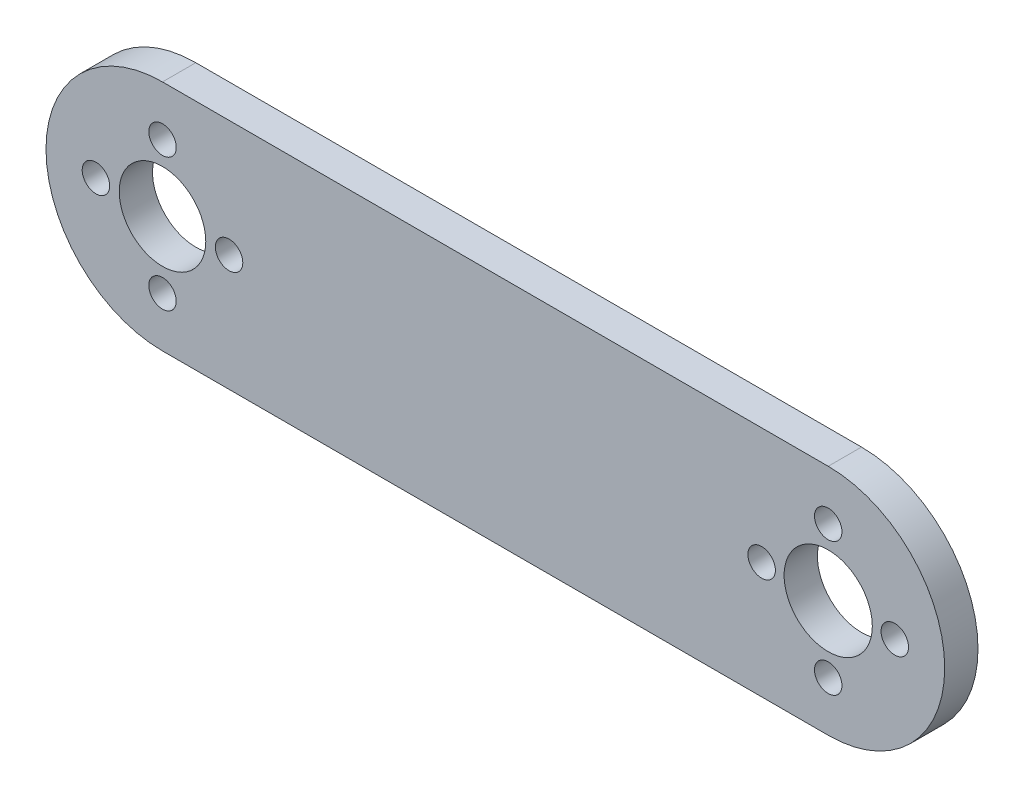
ISO-10303-21;
HEADER;
FILE_DESCRIPTION(('STEP AP214'),'2;1');
FILE_NAME('part.step','',(''),(''),'','','');
FILE_SCHEMA(('AUTOMOTIVE_DESIGN { 1 0 10303 214 1 1 1 1 }'));
ENDSEC;
DATA;
#1=APPLICATION_CONTEXT('core data for automotive mechanical design processes');
#2=APPLICATION_PROTOCOL_DEFINITION('international standard','automotive_design',2000,#1);
#3=PRODUCT_CONTEXT('',#1,'mechanical');
#4=PRODUCT('Part','Part','',(#3));
#5=PRODUCT_RELATED_PRODUCT_CATEGORY('part','',(#4));
#6=PRODUCT_DEFINITION_FORMATION('','',#4);
#7=PRODUCT_DEFINITION_CONTEXT('part definition',#1,'design');
#8=PRODUCT_DEFINITION('design','',#6,#7);
#9=PRODUCT_DEFINITION_SHAPE('','',#8);
#10=(LENGTH_UNIT() NAMED_UNIT(*) SI_UNIT(.MILLI.,.METRE.));
#11=(NAMED_UNIT(*) PLANE_ANGLE_UNIT() SI_UNIT($,.RADIAN.));
#12=(NAMED_UNIT(*) SI_UNIT($,.STERADIAN.) SOLID_ANGLE_UNIT());
#13=UNCERTAINTY_MEASURE_WITH_UNIT(LENGTH_MEASURE(1.E-05),#10,'distance_accuracy_value','');
#14=(GEOMETRIC_REPRESENTATION_CONTEXT(3) GLOBAL_UNCERTAINTY_ASSIGNED_CONTEXT((#13)) GLOBAL_UNIT_ASSIGNED_CONTEXT((#10,
#11,#12)) REPRESENTATION_CONTEXT('',''));
#15=CARTESIAN_POINT('',(0.,0.,0.));
#16=DIRECTION('',(0.,0.,1.));
#17=DIRECTION('',(1.,0.,0.));
#18=AXIS2_PLACEMENT_3D('',#15,#16,#17);
#19=CARTESIAN_POINT('',(0.,0.,4.));
#20=DIRECTION('',(0.,0.,-1.));
#21=DIRECTION('',(-1.,0.,0.));
#22=AXIS2_PLACEMENT_3D('',#19,#20,#21);
#23=CYLINDRICAL_SURFACE('',#22,14.);
#24=CARTESIAN_POINT('',(0.,0.,0.));
#25=DIRECTION('',(0.,0.,1.));
#26=DIRECTION('',(1.,0.,0.));
#27=AXIS2_PLACEMENT_3D('',#24,#25,#26);
#28=CIRCLE('',#27,14.);
#29=CARTESIAN_POINT('',(0.,14.,0.));
#30=VERTEX_POINT('',#29);
#31=CARTESIAN_POINT('',(0.,-14.,0.));
#32=VERTEX_POINT('',#31);
#33=EDGE_CURVE('E132',#30,#32,#28,.T.);
#34=ORIENTED_EDGE('',*,*,#33,.T.);
#35=DIRECTION('',(0.,0.,-1.));
#36=VECTOR('',#35,1.);
#37=CARTESIAN_POINT('',(0.,-14.,4.));
#38=LINE('',#37,#36);
#39=CARTESIAN_POINT('',(0.,-14.,4.));
#40=VERTEX_POINT('',#39);
#41=EDGE_CURVE('E11',#40,#32,#38,.T.);
#42=ORIENTED_EDGE('',*,*,#41,.F.);
#43=CARTESIAN_POINT('',(0.,0.,4.));
#44=DIRECTION('',(0.,0.,1.));
#45=DIRECTION('',(1.,0.,0.));
#46=AXIS2_PLACEMENT_3D('',#43,#44,#45);
#47=CIRCLE('',#46,14.);
#48=CARTESIAN_POINT('',(0.,14.,4.));
#49=VERTEX_POINT('',#48);
#50=EDGE_CURVE('E88',#49,#40,#47,.T.);
#51=ORIENTED_EDGE('',*,*,#50,.F.);
#52=DIRECTION('',(0.,0.,-1.));
#53=VECTOR('',#52,1.);
#54=CARTESIAN_POINT('',(0.,14.,4.));
#55=LINE('',#54,#53);
#56=EDGE_CURVE('E54',#49,#30,#55,.T.);
#57=ORIENTED_EDGE('',*,*,#56,.T.);
#58=EDGE_LOOP('',(#34,#42,#51,#57));
#59=FACE_BOUND('',#58,.T.);
#60=ADVANCED_FACE('F37',(#59),#23,.T.);
#61=CARTESIAN_POINT('',(0.,-14.,4.));
#62=DIRECTION('',(0.,1.,0.));
#63=DIRECTION('',(-1.,0.,0.));
#64=AXIS2_PLACEMENT_3D('',#61,#62,#63);
#65=PLANE('',#64);
#66=DIRECTION('',(1.,0.,0.));
#67=VECTOR('',#66,1.);
#68=CARTESIAN_POINT('',(0.,-14.,0.));
#69=LINE('',#68,#67);
#70=CARTESIAN_POINT('',(80.,-14.,0.));
#71=VERTEX_POINT('',#70);
#72=EDGE_CURVE('E93',#32,#71,#69,.T.);
#73=ORIENTED_EDGE('',*,*,#72,.T.);
#74=DIRECTION('',(0.,0.,-1.));
#75=VECTOR('',#74,1.);
#76=CARTESIAN_POINT('',(80.,-14.,4.));
#77=LINE('',#76,#75);
#78=CARTESIAN_POINT('',(80.,-14.,4.));
#79=VERTEX_POINT('',#78);
#80=EDGE_CURVE('E46',#79,#71,#77,.T.);
#81=ORIENTED_EDGE('',*,*,#80,.F.);
#82=DIRECTION('',(1.,0.,0.));
#83=VECTOR('',#82,1.);
#84=CARTESIAN_POINT('',(0.,-14.,4.));
#85=LINE('',#84,#83);
#86=EDGE_CURVE('E80',#40,#79,#85,.T.);
#87=ORIENTED_EDGE('',*,*,#86,.F.);
#88=ORIENTED_EDGE('',*,*,#41,.T.);
#89=EDGE_LOOP('',(#73,#81,#87,#88));
#90=FACE_BOUND('',#89,.T.);
#91=ADVANCED_FACE('F92',(#90),#65,.F.);
#92=CARTESIAN_POINT('',(80.,0.,4.));
#93=DIRECTION('',(0.,0.,-1.));
#94=DIRECTION('',(-1.,0.,0.));
#95=AXIS2_PLACEMENT_3D('',#92,#93,#94);
#96=CYLINDRICAL_SURFACE('',#95,14.);
#97=CARTESIAN_POINT('',(80.,0.,0.));
#98=DIRECTION('',(0.,0.,1.));
#99=DIRECTION('',(1.,0.,0.));
#100=AXIS2_PLACEMENT_3D('',#97,#98,#99);
#101=CIRCLE('',#100,14.);
#102=CARTESIAN_POINT('',(80.,14.,0.));
#103=VERTEX_POINT('',#102);
#104=EDGE_CURVE('E135',#71,#103,#101,.T.);
#105=ORIENTED_EDGE('',*,*,#104,.T.);
#106=DIRECTION('',(0.,0.,-1.));
#107=VECTOR('',#106,1.);
#108=CARTESIAN_POINT('',(80.,14.,4.));
#109=LINE('',#108,#107);
#110=CARTESIAN_POINT('',(80.,14.,4.));
#111=VERTEX_POINT('',#110);
#112=EDGE_CURVE('E69',#111,#103,#109,.T.);
#113=ORIENTED_EDGE('',*,*,#112,.F.);
#114=CARTESIAN_POINT('',(80.,0.,4.));
#115=DIRECTION('',(0.,0.,1.));
#116=DIRECTION('',(1.,0.,0.));
#117=AXIS2_PLACEMENT_3D('',#114,#115,#116);
#118=CIRCLE('',#117,14.);
#119=EDGE_CURVE('E87',#79,#111,#118,.T.);
#120=ORIENTED_EDGE('',*,*,#119,.F.);
#121=ORIENTED_EDGE('',*,*,#80,.T.);
#122=EDGE_LOOP('',(#105,#113,#120,#121));
#123=FACE_BOUND('',#122,.T.);
#124=ADVANCED_FACE('F96',(#123),#96,.T.);
#125=CARTESIAN_POINT('',(0.,14.,4.));
#126=DIRECTION('',(0.,1.,0.));
#127=DIRECTION('',(-1.,0.,0.));
#128=AXIS2_PLACEMENT_3D('',#125,#126,#127);
#129=PLANE('',#128);
#130=DIRECTION('',(1.,0.,0.));
#131=VECTOR('',#130,1.);
#132=CARTESIAN_POINT('',(0.,14.,0.));
#133=LINE('',#132,#131);
#134=EDGE_CURVE('E137',#30,#103,#133,.T.);
#135=ORIENTED_EDGE('',*,*,#134,.F.);
#136=ORIENTED_EDGE('',*,*,#56,.F.);
#137=DIRECTION('',(1.,0.,0.));
#138=VECTOR('',#137,1.);
#139=CARTESIAN_POINT('',(0.,14.,4.));
#140=LINE('',#139,#138);
#141=EDGE_CURVE('E97',#49,#111,#140,.T.);
#142=ORIENTED_EDGE('',*,*,#141,.T.);
#143=ORIENTED_EDGE('',*,*,#112,.T.);
#144=EDGE_LOOP('',(#135,#136,#142,#143));
#145=FACE_BOUND('',#144,.T.);
#146=ADVANCED_FACE('F205',(#145),#129,.T.);
#147=CARTESIAN_POINT('',(0.,0.,4.));
#148=DIRECTION('',(0.,0.,-1.));
#149=DIRECTION('',(-1.,0.,0.));
#150=AXIS2_PLACEMENT_3D('',#147,#148,#149);
#151=CYLINDRICAL_SURFACE('',#150,5.2);
#152=CARTESIAN_POINT('',(0.,0.,4.));
#153=DIRECTION('',(0.,0.,1.));
#154=DIRECTION('',(1.,0.,0.));
#155=AXIS2_PLACEMENT_3D('',#152,#153,#154);
#156=CIRCLE('',#155,5.2);
#157=CARTESIAN_POINT('',(5.2,0.,4.));
#158=VERTEX_POINT('',#157);
#159=EDGE_CURVE('E173',#158,#158,#156,.T.);
#160=ORIENTED_EDGE('',*,*,#159,.T.);
#161=EDGE_LOOP('',(#160));
#162=FACE_BOUND('',#161,.T.);
#163=CARTESIAN_POINT('',(0.,0.,0.));
#164=DIRECTION('',(0.,0.,1.));
#165=DIRECTION('',(1.,0.,0.));
#166=AXIS2_PLACEMENT_3D('',#163,#164,#165);
#167=CIRCLE('',#166,5.2);
#168=CARTESIAN_POINT('',(5.2,0.,0.));
#169=VERTEX_POINT('',#168);
#170=EDGE_CURVE('E129',#169,#169,#167,.T.);
#171=ORIENTED_EDGE('',*,*,#170,.F.);
#172=EDGE_LOOP('',(#171));
#173=FACE_BOUND('',#172,.T.);
#174=ADVANCED_FACE('F177',(#162,#173),#151,.F.);
#175=CARTESIAN_POINT('',(0.,-8.,4.));
#176=DIRECTION('',(0.,0.,-1.));
#177=DIRECTION('',(-1.,0.,0.));
#178=AXIS2_PLACEMENT_3D('',#175,#176,#177);
#179=CYLINDRICAL_SURFACE('',#178,1.65);
#180=CARTESIAN_POINT('',(0.,-8.,4.));
#181=DIRECTION('',(0.,0.,1.));
#182=DIRECTION('',(1.,0.,0.));
#183=AXIS2_PLACEMENT_3D('',#180,#181,#182);
#184=CIRCLE('',#183,1.65);
#185=CARTESIAN_POINT('',(1.65,-8.,4.));
#186=VERTEX_POINT('',#185);
#187=EDGE_CURVE('E170',#186,#186,#184,.T.);
#188=ORIENTED_EDGE('',*,*,#187,.T.);
#189=EDGE_LOOP('',(#188));
#190=FACE_BOUND('',#189,.T.);
#191=CARTESIAN_POINT('',(0.,-8.,0.));
#192=DIRECTION('',(0.,0.,1.));
#193=DIRECTION('',(1.,0.,0.));
#194=AXIS2_PLACEMENT_3D('',#191,#192,#193);
#195=CIRCLE('',#194,1.65);
#196=CARTESIAN_POINT('',(1.65,-8.,0.));
#197=VERTEX_POINT('',#196);
#198=EDGE_CURVE('E126',#197,#197,#195,.T.);
#199=ORIENTED_EDGE('',*,*,#198,.F.);
#200=EDGE_LOOP('',(#199));
#201=FACE_BOUND('',#200,.T.);
#202=ADVANCED_FACE('F204',(#190,#201),#179,.F.);
#203=CARTESIAN_POINT('',(8.,0.,4.));
#204=DIRECTION('',(0.,0.,-1.));
#205=DIRECTION('',(-1.,0.,0.));
#206=AXIS2_PLACEMENT_3D('',#203,#204,#205);
#207=CYLINDRICAL_SURFACE('',#206,1.65);
#208=CARTESIAN_POINT('',(8.,0.,4.));
#209=DIRECTION('',(0.,0.,1.));
#210=DIRECTION('',(1.,0.,0.));
#211=AXIS2_PLACEMENT_3D('',#208,#209,#210);
#212=CIRCLE('',#211,1.65);
#213=CARTESIAN_POINT('',(9.65,0.,4.));
#214=VERTEX_POINT('',#213);
#215=EDGE_CURVE('E167',#214,#214,#212,.T.);
#216=ORIENTED_EDGE('',*,*,#215,.T.);
#217=EDGE_LOOP('',(#216));
#218=FACE_BOUND('',#217,.T.);
#219=CARTESIAN_POINT('',(8.,0.,0.));
#220=DIRECTION('',(0.,0.,1.));
#221=DIRECTION('',(1.,0.,0.));
#222=AXIS2_PLACEMENT_3D('',#219,#220,#221);
#223=CIRCLE('',#222,1.65);
#224=CARTESIAN_POINT('',(9.65,0.,0.));
#225=VERTEX_POINT('',#224);
#226=EDGE_CURVE('E123',#225,#225,#223,.T.);
#227=ORIENTED_EDGE('',*,*,#226,.F.);
#228=EDGE_LOOP('',(#227));
#229=FACE_BOUND('',#228,.T.);
#230=ADVANCED_FACE('F208',(#218,#229),#207,.F.);
#231=CARTESIAN_POINT('',(0.,8.,4.));
#232=DIRECTION('',(0.,0.,-1.));
#233=DIRECTION('',(-1.,0.,0.));
#234=AXIS2_PLACEMENT_3D('',#231,#232,#233);
#235=CYLINDRICAL_SURFACE('',#234,1.65);
#236=CARTESIAN_POINT('',(0.,8.,4.));
#237=DIRECTION('',(0.,0.,1.));
#238=DIRECTION('',(1.,0.,0.));
#239=AXIS2_PLACEMENT_3D('',#236,#237,#238);
#240=CIRCLE('',#239,1.65);
#241=CARTESIAN_POINT('',(1.65,8.,4.));
#242=VERTEX_POINT('',#241);
#243=EDGE_CURVE('E164',#242,#242,#240,.T.);
#244=ORIENTED_EDGE('',*,*,#243,.T.);
#245=EDGE_LOOP('',(#244));
#246=FACE_BOUND('',#245,.T.);
#247=CARTESIAN_POINT('',(0.,8.,0.));
#248=DIRECTION('',(0.,0.,1.));
#249=DIRECTION('',(1.,0.,0.));
#250=AXIS2_PLACEMENT_3D('',#247,#248,#249);
#251=CIRCLE('',#250,1.65);
#252=CARTESIAN_POINT('',(1.65,8.,0.));
#253=VERTEX_POINT('',#252);
#254=EDGE_CURVE('E120',#253,#253,#251,.T.);
#255=ORIENTED_EDGE('',*,*,#254,.F.);
#256=EDGE_LOOP('',(#255));
#257=FACE_BOUND('',#256,.T.);
#258=ADVANCED_FACE('F212',(#246,#257),#235,.F.);
#259=CARTESIAN_POINT('',(72.,0.,4.));
#260=DIRECTION('',(0.,0.,-1.));
#261=DIRECTION('',(-1.,0.,0.));
#262=AXIS2_PLACEMENT_3D('',#259,#260,#261);
#263=CYLINDRICAL_SURFACE('',#262,1.64999999999999);
#264=CARTESIAN_POINT('',(72.,0.,4.));
#265=DIRECTION('',(0.,0.,1.));
#266=DIRECTION('',(1.,0.,0.));
#267=AXIS2_PLACEMENT_3D('',#264,#265,#266);
#268=CIRCLE('',#267,1.64999999999999);
#269=CARTESIAN_POINT('',(73.65,0.,4.));
#270=VERTEX_POINT('',#269);
#271=EDGE_CURVE('E161',#270,#270,#268,.T.);
#272=ORIENTED_EDGE('',*,*,#271,.T.);
#273=EDGE_LOOP('',(#272));
#274=FACE_BOUND('',#273,.T.);
#275=CARTESIAN_POINT('',(72.,0.,0.));
#276=DIRECTION('',(0.,0.,1.));
#277=DIRECTION('',(1.,0.,0.));
#278=AXIS2_PLACEMENT_3D('',#275,#276,#277);
#279=CIRCLE('',#278,1.64999999999999);
#280=CARTESIAN_POINT('',(73.65,0.,0.));
#281=VERTEX_POINT('',#280);
#282=EDGE_CURVE('E117',#281,#281,#279,.T.);
#283=ORIENTED_EDGE('',*,*,#282,.F.);
#284=EDGE_LOOP('',(#283));
#285=FACE_BOUND('',#284,.T.);
#286=ADVANCED_FACE('F216',(#274,#285),#263,.F.);
#287=CARTESIAN_POINT('',(88.,0.,4.));
#288=DIRECTION('',(0.,0.,-1.));
#289=DIRECTION('',(-1.,0.,0.));
#290=AXIS2_PLACEMENT_3D('',#287,#288,#289);
#291=CYLINDRICAL_SURFACE('',#290,1.65);
#292=CARTESIAN_POINT('',(88.,0.,4.));
#293=DIRECTION('',(0.,0.,1.));
#294=DIRECTION('',(1.,0.,0.));
#295=AXIS2_PLACEMENT_3D('',#292,#293,#294);
#296=CIRCLE('',#295,1.65);
#297=CARTESIAN_POINT('',(89.65,0.,4.));
#298=VERTEX_POINT('',#297);
#299=EDGE_CURVE('E158',#298,#298,#296,.T.);
#300=ORIENTED_EDGE('',*,*,#299,.T.);
#301=EDGE_LOOP('',(#300));
#302=FACE_BOUND('',#301,.T.);
#303=CARTESIAN_POINT('',(88.,0.,0.));
#304=DIRECTION('',(0.,0.,1.));
#305=DIRECTION('',(1.,0.,0.));
#306=AXIS2_PLACEMENT_3D('',#303,#304,#305);
#307=CIRCLE('',#306,1.65);
#308=CARTESIAN_POINT('',(89.65,0.,0.));
#309=VERTEX_POINT('',#308);
#310=EDGE_CURVE('E114',#309,#309,#307,.T.);
#311=ORIENTED_EDGE('',*,*,#310,.F.);
#312=EDGE_LOOP('',(#311));
#313=FACE_BOUND('',#312,.T.);
#314=ADVANCED_FACE('F220',(#302,#313),#291,.F.);
#315=CARTESIAN_POINT('',(80.,8.,4.));
#316=DIRECTION('',(0.,0.,-1.));
#317=DIRECTION('',(-1.,0.,0.));
#318=AXIS2_PLACEMENT_3D('',#315,#316,#317);
#319=CYLINDRICAL_SURFACE('',#318,1.65);
#320=CARTESIAN_POINT('',(80.,8.,4.));
#321=DIRECTION('',(0.,0.,1.));
#322=DIRECTION('',(1.,0.,0.));
#323=AXIS2_PLACEMENT_3D('',#320,#321,#322);
#324=CIRCLE('',#323,1.65);
#325=CARTESIAN_POINT('',(81.65,8.,4.));
#326=VERTEX_POINT('',#325);
#327=EDGE_CURVE('E153',#326,#326,#324,.T.);
#328=ORIENTED_EDGE('',*,*,#327,.T.);
#329=EDGE_LOOP('',(#328));
#330=FACE_BOUND('',#329,.T.);
#331=CARTESIAN_POINT('',(80.,8.,0.));
#332=DIRECTION('',(0.,0.,1.));
#333=DIRECTION('',(1.,0.,0.));
#334=AXIS2_PLACEMENT_3D('',#331,#332,#333);
#335=CIRCLE('',#334,1.65);
#336=CARTESIAN_POINT('',(81.65,8.,0.));
#337=VERTEX_POINT('',#336);
#338=EDGE_CURVE('E111',#337,#337,#335,.T.);
#339=ORIENTED_EDGE('',*,*,#338,.F.);
#340=EDGE_LOOP('',(#339));
#341=FACE_BOUND('',#340,.T.);
#342=ADVANCED_FACE('F224',(#330,#341),#319,.F.);
#343=CARTESIAN_POINT('',(80.,0.,4.));
#344=DIRECTION('',(0.,0.,-1.));
#345=DIRECTION('',(-1.,0.,0.));
#346=AXIS2_PLACEMENT_3D('',#343,#344,#345);
#347=CYLINDRICAL_SURFACE('',#346,5.3);
#348=CARTESIAN_POINT('',(80.,0.,4.));
#349=DIRECTION('',(0.,0.,1.));
#350=DIRECTION('',(1.,0.,0.));
#351=AXIS2_PLACEMENT_3D('',#348,#349,#350);
#352=CIRCLE('',#351,5.3);
#353=CARTESIAN_POINT('',(85.3,0.,4.));
#354=VERTEX_POINT('',#353);
#355=EDGE_CURVE('E148',#354,#354,#352,.T.);
#356=ORIENTED_EDGE('',*,*,#355,.T.);
#357=EDGE_LOOP('',(#356));
#358=FACE_BOUND('',#357,.T.);
#359=CARTESIAN_POINT('',(80.,0.,0.));
#360=DIRECTION('',(0.,0.,1.));
#361=DIRECTION('',(1.,0.,0.));
#362=AXIS2_PLACEMENT_3D('',#359,#360,#361);
#363=CIRCLE('',#362,5.3);
#364=CARTESIAN_POINT('',(85.3,0.,0.));
#365=VERTEX_POINT('',#364);
#366=EDGE_CURVE('E108',#365,#365,#363,.T.);
#367=ORIENTED_EDGE('',*,*,#366,.F.);
#368=EDGE_LOOP('',(#367));
#369=FACE_BOUND('',#368,.T.);
#370=ADVANCED_FACE('F227',(#358,#369),#347,.F.);
#371=CARTESIAN_POINT('',(80.,-8.,4.));
#372=DIRECTION('',(0.,0.,-1.));
#373=DIRECTION('',(-1.,0.,0.));
#374=AXIS2_PLACEMENT_3D('',#371,#372,#373);
#375=CYLINDRICAL_SURFACE('',#374,1.65);
#376=CARTESIAN_POINT('',(80.,-8.,4.));
#377=DIRECTION('',(0.,0.,1.));
#378=DIRECTION('',(1.,0.,0.));
#379=AXIS2_PLACEMENT_3D('',#376,#377,#378);
#380=CIRCLE('',#379,1.65);
#381=CARTESIAN_POINT('',(81.65,-8.,4.));
#382=VERTEX_POINT('',#381);
#383=EDGE_CURVE('E143',#382,#382,#380,.T.);
#384=ORIENTED_EDGE('',*,*,#383,.T.);
#385=EDGE_LOOP('',(#384));
#386=FACE_BOUND('',#385,.T.);
#387=CARTESIAN_POINT('',(80.,-8.,0.));
#388=DIRECTION('',(0.,0.,1.));
#389=DIRECTION('',(1.,0.,0.));
#390=AXIS2_PLACEMENT_3D('',#387,#388,#389);
#391=CIRCLE('',#390,1.65);
#392=CARTESIAN_POINT('',(81.65,-8.,0.));
#393=VERTEX_POINT('',#392);
#394=EDGE_CURVE('E105',#393,#393,#391,.T.);
#395=ORIENTED_EDGE('',*,*,#394,.F.);
#396=EDGE_LOOP('',(#395));
#397=FACE_BOUND('',#396,.T.);
#398=ADVANCED_FACE('F39',(#386,#397),#375,.F.);
#399=CARTESIAN_POINT('',(-8.,0.,4.));
#400=DIRECTION('',(0.,0.,-1.));
#401=DIRECTION('',(-1.,0.,0.));
#402=AXIS2_PLACEMENT_3D('',#399,#400,#401);
#403=CYLINDRICAL_SURFACE('',#402,1.65);
#404=CARTESIAN_POINT('',(-8.,0.,4.));
#405=DIRECTION('',(0.,0.,1.));
#406=DIRECTION('',(1.,0.,0.));
#407=AXIS2_PLACEMENT_3D('',#404,#405,#406);
#408=CIRCLE('',#407,1.65);
#409=CARTESIAN_POINT('',(-6.35,0.,4.));
#410=VERTEX_POINT('',#409);
#411=EDGE_CURVE('E99',#410,#410,#408,.T.);
#412=ORIENTED_EDGE('',*,*,#411,.T.);
#413=EDGE_LOOP('',(#412));
#414=FACE_BOUND('',#413,.T.);
#415=CARTESIAN_POINT('',(-8.,0.,0.));
#416=DIRECTION('',(0.,0.,1.));
#417=DIRECTION('',(1.,0.,0.));
#418=AXIS2_PLACEMENT_3D('',#415,#416,#417);
#419=CIRCLE('',#418,1.65);
#420=CARTESIAN_POINT('',(-6.35,0.,0.));
#421=VERTEX_POINT('',#420);
#422=EDGE_CURVE('E140',#421,#421,#419,.T.);
#423=ORIENTED_EDGE('',*,*,#422,.F.);
#424=EDGE_LOOP('',(#423));
#425=FACE_BOUND('',#424,.T.);
#426=ADVANCED_FACE('F182',(#414,#425),#403,.F.);
#427=CARTESIAN_POINT('',(0.,0.,4.));
#428=DIRECTION('',(0.,0.,1.));
#429=DIRECTION('',(1.,0.,0.));
#430=AXIS2_PLACEMENT_3D('',#427,#428,#429);
#431=PLANE('',#430);
#432=ORIENTED_EDGE('',*,*,#383,.F.);
#433=EDGE_LOOP('',(#432));
#434=FACE_BOUND('',#433,.T.);
#435=ORIENTED_EDGE('',*,*,#355,.F.);
#436=EDGE_LOOP('',(#435));
#437=FACE_BOUND('',#436,.T.);
#438=ORIENTED_EDGE('',*,*,#327,.F.);
#439=EDGE_LOOP('',(#438));
#440=FACE_BOUND('',#439,.T.);
#441=ORIENTED_EDGE('',*,*,#299,.F.);
#442=EDGE_LOOP('',(#441));
#443=FACE_BOUND('',#442,.T.);
#444=ORIENTED_EDGE('',*,*,#271,.F.);
#445=EDGE_LOOP('',(#444));
#446=FACE_BOUND('',#445,.T.);
#447=ORIENTED_EDGE('',*,*,#243,.F.);
#448=EDGE_LOOP('',(#447));
#449=FACE_BOUND('',#448,.T.);
#450=ORIENTED_EDGE('',*,*,#215,.F.);
#451=EDGE_LOOP('',(#450));
#452=FACE_BOUND('',#451,.T.);
#453=ORIENTED_EDGE('',*,*,#187,.F.);
#454=EDGE_LOOP('',(#453));
#455=FACE_BOUND('',#454,.T.);
#456=ORIENTED_EDGE('',*,*,#159,.F.);
#457=EDGE_LOOP('',(#456));
#458=FACE_BOUND('',#457,.T.);
#459=ORIENTED_EDGE('',*,*,#50,.T.);
#460=ORIENTED_EDGE('',*,*,#86,.T.);
#461=ORIENTED_EDGE('',*,*,#119,.T.);
#462=ORIENTED_EDGE('',*,*,#141,.F.);
#463=EDGE_LOOP('',(#459,#460,#461,#462));
#464=FACE_BOUND('',#463,.T.);
#465=ORIENTED_EDGE('',*,*,#411,.F.);
#466=EDGE_LOOP('',(#465));
#467=FACE_BOUND('',#466,.T.);
#468=ADVANCED_FACE('F83',(#434,#437,#440,#443,#446,#449,#452,#455,#458,#464,#467),#431,.T.);
#469=CARTESIAN_POINT('',(0.,0.,0.));
#470=DIRECTION('',(0.,0.,1.));
#471=DIRECTION('',(1.,0.,0.));
#472=AXIS2_PLACEMENT_3D('',#469,#470,#471);
#473=PLANE('',#472);
#474=ORIENTED_EDGE('',*,*,#394,.T.);
#475=EDGE_LOOP('',(#474));
#476=FACE_BOUND('',#475,.T.);
#477=ORIENTED_EDGE('',*,*,#366,.T.);
#478=EDGE_LOOP('',(#477));
#479=FACE_BOUND('',#478,.T.);
#480=ORIENTED_EDGE('',*,*,#338,.T.);
#481=EDGE_LOOP('',(#480));
#482=FACE_BOUND('',#481,.T.);
#483=ORIENTED_EDGE('',*,*,#310,.T.);
#484=EDGE_LOOP('',(#483));
#485=FACE_BOUND('',#484,.T.);
#486=ORIENTED_EDGE('',*,*,#282,.T.);
#487=EDGE_LOOP('',(#486));
#488=FACE_BOUND('',#487,.T.);
#489=ORIENTED_EDGE('',*,*,#254,.T.);
#490=EDGE_LOOP('',(#489));
#491=FACE_BOUND('',#490,.T.);
#492=ORIENTED_EDGE('',*,*,#226,.T.);
#493=EDGE_LOOP('',(#492));
#494=FACE_BOUND('',#493,.T.);
#495=ORIENTED_EDGE('',*,*,#198,.T.);
#496=EDGE_LOOP('',(#495));
#497=FACE_BOUND('',#496,.T.);
#498=ORIENTED_EDGE('',*,*,#170,.T.);
#499=EDGE_LOOP('',(#498));
#500=FACE_BOUND('',#499,.T.);
#501=ORIENTED_EDGE('',*,*,#33,.F.);
#502=ORIENTED_EDGE('',*,*,#134,.T.);
#503=ORIENTED_EDGE('',*,*,#104,.F.);
#504=ORIENTED_EDGE('',*,*,#72,.F.);
#505=EDGE_LOOP('',(#501,#502,#503,#504));
#506=FACE_BOUND('',#505,.T.);
#507=ORIENTED_EDGE('',*,*,#422,.T.);
#508=EDGE_LOOP('',(#507));
#509=FACE_BOUND('',#508,.T.);
#510=ADVANCED_FACE('F181',(#476,#479,#482,#485,#488,#491,#494,#497,#500,#506,#509),#473,.F.);
#511=CLOSED_SHELL('',(#60,#91,#124,#146,#174,#202,#230,#258,#286,#314,#342,#370,#398,#426,#468,#510));
#512=MANIFOLD_SOLID_BREP('B2',#511);
#513=ADVANCED_BREP_SHAPE_REPRESENTATION('',(#18,#512),#14);
#514=SHAPE_DEFINITION_REPRESENTATION(#9,#513);
ENDSEC;
END-ISO-10303-21;
